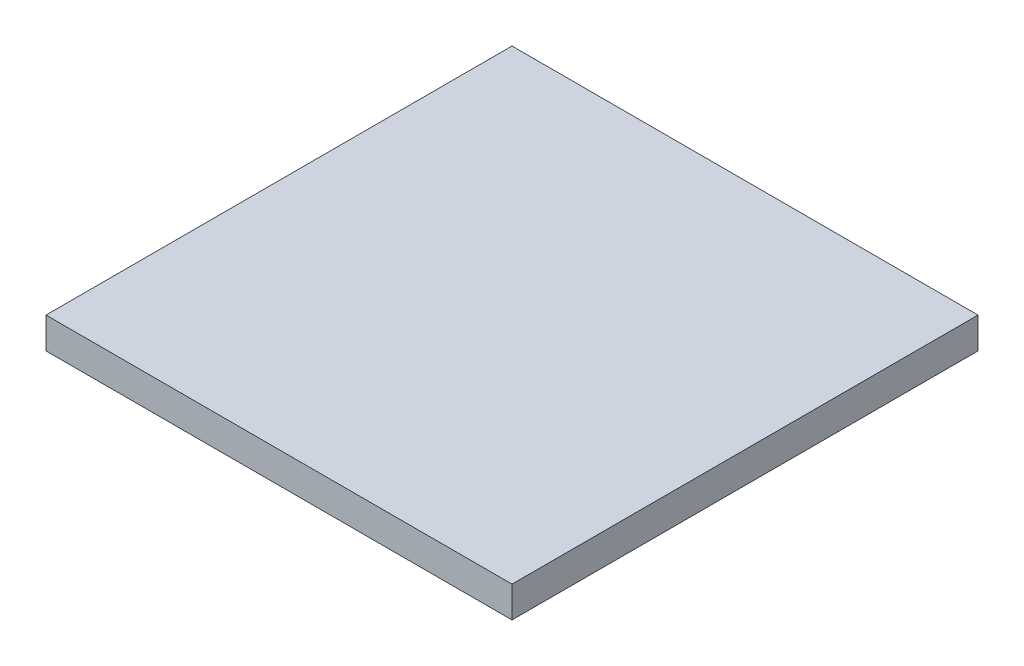
ISO-10303-21;
HEADER;
FILE_DESCRIPTION(('STEP AP214'),'2;1');
FILE_NAME('part.step','',(''),(''),'','','');
FILE_SCHEMA(('AUTOMOTIVE_DESIGN { 1 0 10303 214 1 1 1 1 }'));
ENDSEC;
DATA;
#1=APPLICATION_CONTEXT('core data for automotive mechanical design processes');
#2=APPLICATION_PROTOCOL_DEFINITION('international standard','automotive_design',2000,#1);
#3=PRODUCT_CONTEXT('',#1,'mechanical');
#4=PRODUCT('Part','Part','',(#3));
#5=PRODUCT_RELATED_PRODUCT_CATEGORY('part','',(#4));
#6=PRODUCT_DEFINITION_FORMATION('','',#4);
#7=PRODUCT_DEFINITION_CONTEXT('part definition',#1,'design');
#8=PRODUCT_DEFINITION('design','',#6,#7);
#9=PRODUCT_DEFINITION_SHAPE('','',#8);
#10=(LENGTH_UNIT() NAMED_UNIT(*) SI_UNIT(.MILLI.,.METRE.));
#11=(NAMED_UNIT(*) PLANE_ANGLE_UNIT() SI_UNIT($,.RADIAN.));
#12=(NAMED_UNIT(*) SI_UNIT($,.STERADIAN.) SOLID_ANGLE_UNIT());
#13=UNCERTAINTY_MEASURE_WITH_UNIT(LENGTH_MEASURE(1.E-05),#10,'distance_accuracy_value','');
#14=(GEOMETRIC_REPRESENTATION_CONTEXT(3) GLOBAL_UNCERTAINTY_ASSIGNED_CONTEXT((#13)) GLOBAL_UNIT_ASSIGNED_CONTEXT((#10,
#11,#12)) REPRESENTATION_CONTEXT('',''));
#15=CARTESIAN_POINT('',(0.,0.,0.));
#16=DIRECTION('',(0.,0.,1.));
#17=DIRECTION('',(1.,0.,0.));
#18=AXIS2_PLACEMENT_3D('',#15,#16,#17);
#19=CARTESIAN_POINT('',(150.,20.,150.));
#20=DIRECTION('',(-1.,0.,0.));
#21=DIRECTION('',(0.,0.,1.));
#22=AXIS2_PLACEMENT_3D('',#19,#20,#21);
#23=PLANE('',#22);
#24=DIRECTION('',(0.,0.,-1.));
#25=VECTOR('',#24,1.);
#26=CARTESIAN_POINT('',(150.,0.,150.));
#27=LINE('',#26,#25);
#28=CARTESIAN_POINT('',(150.,0.,150.));
#29=VERTEX_POINT('',#28);
#30=CARTESIAN_POINT('',(150.,0.,-150.));
#31=VERTEX_POINT('',#30);
#32=EDGE_CURVE('E96',#29,#31,#27,.T.);
#33=ORIENTED_EDGE('',*,*,#32,.T.);
#34=DIRECTION('',(0.,-1.,0.));
#35=VECTOR('',#34,1.);
#36=CARTESIAN_POINT('',(150.,20.,-150.));
#37=LINE('',#36,#35);
#38=CARTESIAN_POINT('',(150.,20.,-150.));
#39=VERTEX_POINT('',#38);
#40=EDGE_CURVE('E11',#39,#31,#37,.T.);
#41=ORIENTED_EDGE('',*,*,#40,.F.);
#42=DIRECTION('',(0.,0.,-1.));
#43=VECTOR('',#42,1.);
#44=CARTESIAN_POINT('',(150.,20.,150.));
#45=LINE('',#44,#43);
#46=CARTESIAN_POINT('',(150.,20.,150.));
#47=VERTEX_POINT('',#46);
#48=EDGE_CURVE('E84',#47,#39,#45,.T.);
#49=ORIENTED_EDGE('',*,*,#48,.F.);
#50=DIRECTION('',(0.,-1.,0.));
#51=VECTOR('',#50,1.);
#52=CARTESIAN_POINT('',(150.,20.,150.));
#53=LINE('',#52,#51);
#54=EDGE_CURVE('E92',#47,#29,#53,.T.);
#55=ORIENTED_EDGE('',*,*,#54,.T.);
#56=EDGE_LOOP('',(#33,#41,#49,#55));
#57=FACE_BOUND('',#56,.T.);
#58=ADVANCED_FACE('F33',(#57),#23,.F.);
#59=CARTESIAN_POINT('',(-150.,20.,-150.));
#60=DIRECTION('',(0.,0.,1.));
#61=DIRECTION('',(1.,0.,0.));
#62=AXIS2_PLACEMENT_3D('',#59,#60,#61);
#63=PLANE('',#62);
#64=DIRECTION('',(-1.,0.,0.));
#65=VECTOR('',#64,1.);
#66=CARTESIAN_POINT('',(-150.,0.,-150.));
#67=LINE('',#66,#65);
#68=CARTESIAN_POINT('',(-150.,0.,-150.));
#69=VERTEX_POINT('',#68);
#70=EDGE_CURVE('E88',#31,#69,#67,.T.);
#71=ORIENTED_EDGE('',*,*,#70,.T.);
#72=DIRECTION('',(0.,-1.,0.));
#73=VECTOR('',#72,1.);
#74=CARTESIAN_POINT('',(-150.,20.,-150.));
#75=LINE('',#74,#73);
#76=CARTESIAN_POINT('',(-150.,20.,-150.));
#77=VERTEX_POINT('',#76);
#78=EDGE_CURVE('E41',#77,#69,#75,.T.);
#79=ORIENTED_EDGE('',*,*,#78,.F.);
#80=DIRECTION('',(-1.,0.,0.));
#81=VECTOR('',#80,1.);
#82=CARTESIAN_POINT('',(-150.,20.,-150.));
#83=LINE('',#82,#81);
#84=EDGE_CURVE('E79',#39,#77,#83,.T.);
#85=ORIENTED_EDGE('',*,*,#84,.F.);
#86=ORIENTED_EDGE('',*,*,#40,.T.);
#87=EDGE_LOOP('',(#71,#79,#85,#86));
#88=FACE_BOUND('',#87,.T.);
#89=ADVANCED_FACE('F87',(#88),#63,.F.);
#90=CARTESIAN_POINT('',(-150.,20.,150.));
#91=DIRECTION('',(1.,0.,0.));
#92=DIRECTION('',(0.,0.,-1.));
#93=AXIS2_PLACEMENT_3D('',#90,#91,#92);
#94=PLANE('',#93);
#95=DIRECTION('',(0.,0.,1.));
#96=VECTOR('',#95,1.);
#97=CARTESIAN_POINT('',(-150.,0.,150.));
#98=LINE('',#97,#96);
#99=CARTESIAN_POINT('',(-150.,0.,150.));
#100=VERTEX_POINT('',#99);
#101=EDGE_CURVE('E66',#69,#100,#98,.T.);
#102=ORIENTED_EDGE('',*,*,#101,.T.);
#103=DIRECTION('',(0.,-1.,0.));
#104=VECTOR('',#103,1.);
#105=CARTESIAN_POINT('',(-150.,20.,150.));
#106=LINE('',#105,#104);
#107=CARTESIAN_POINT('',(-150.,20.,150.));
#108=VERTEX_POINT('',#107);
#109=EDGE_CURVE('E89',#108,#100,#106,.T.);
#110=ORIENTED_EDGE('',*,*,#109,.F.);
#111=DIRECTION('',(0.,0.,1.));
#112=VECTOR('',#111,1.);
#113=CARTESIAN_POINT('',(-150.,20.,150.));
#114=LINE('',#113,#112);
#115=EDGE_CURVE('E82',#77,#108,#114,.T.);
#116=ORIENTED_EDGE('',*,*,#115,.F.);
#117=ORIENTED_EDGE('',*,*,#78,.T.);
#118=EDGE_LOOP('',(#102,#110,#116,#117));
#119=FACE_BOUND('',#118,.T.);
#120=ADVANCED_FACE('F90',(#119),#94,.F.);
#121=CARTESIAN_POINT('',(-150.,20.,150.));
#122=DIRECTION('',(0.,0.,-1.));
#123=DIRECTION('',(-1.,0.,0.));
#124=AXIS2_PLACEMENT_3D('',#121,#122,#123);
#125=PLANE('',#124);
#126=DIRECTION('',(1.,0.,0.));
#127=VECTOR('',#126,1.);
#128=CARTESIAN_POINT('',(-150.,0.,150.));
#129=LINE('',#128,#127);
#130=EDGE_CURVE('E72',#100,#29,#129,.T.);
#131=ORIENTED_EDGE('',*,*,#130,.T.);
#132=ORIENTED_EDGE('',*,*,#54,.F.);
#133=DIRECTION('',(1.,0.,0.));
#134=VECTOR('',#133,1.);
#135=CARTESIAN_POINT('',(-150.,20.,150.));
#136=LINE('',#135,#134);
#137=EDGE_CURVE('E49',#108,#47,#136,.T.);
#138=ORIENTED_EDGE('',*,*,#137,.F.);
#139=ORIENTED_EDGE('',*,*,#109,.T.);
#140=EDGE_LOOP('',(#131,#132,#138,#139));
#141=FACE_BOUND('',#140,.T.);
#142=ADVANCED_FACE('F103',(#141),#125,.F.);
#143=CARTESIAN_POINT('',(0.,20.,0.));
#144=DIRECTION('',(0.,-1.,0.));
#145=DIRECTION('',(0.,0.,-1.));
#146=AXIS2_PLACEMENT_3D('',#143,#144,#145);
#147=PLANE('',#146);
#148=ORIENTED_EDGE('',*,*,#48,.T.);
#149=ORIENTED_EDGE('',*,*,#84,.T.);
#150=ORIENTED_EDGE('',*,*,#115,.T.);
#151=ORIENTED_EDGE('',*,*,#137,.T.);
#152=EDGE_LOOP('',(#148,#149,#150,#151));
#153=FACE_BOUND('',#152,.T.);
#154=ADVANCED_FACE('F80',(#153),#147,.F.);
#155=CARTESIAN_POINT('',(0.,0.,0.));
#156=DIRECTION('',(0.,-1.,0.));
#157=DIRECTION('',(0.,0.,-1.));
#158=AXIS2_PLACEMENT_3D('',#155,#156,#157);
#159=PLANE('',#158);
#160=ORIENTED_EDGE('',*,*,#32,.F.);
#161=ORIENTED_EDGE('',*,*,#130,.F.);
#162=ORIENTED_EDGE('',*,*,#101,.F.);
#163=ORIENTED_EDGE('',*,*,#70,.F.);
#164=EDGE_LOOP('',(#160,#161,#162,#163));
#165=FACE_BOUND('',#164,.T.);
#166=ADVANCED_FACE('F106',(#165),#159,.T.);
#167=CLOSED_SHELL('',(#58,#89,#120,#142,#154,#166));
#168=MANIFOLD_SOLID_BREP('B2',#167);
#169=ADVANCED_BREP_SHAPE_REPRESENTATION('',(#18,#168),#14);
#170=SHAPE_DEFINITION_REPRESENTATION(#9,#169);
ENDSEC;
END-ISO-10303-21;
